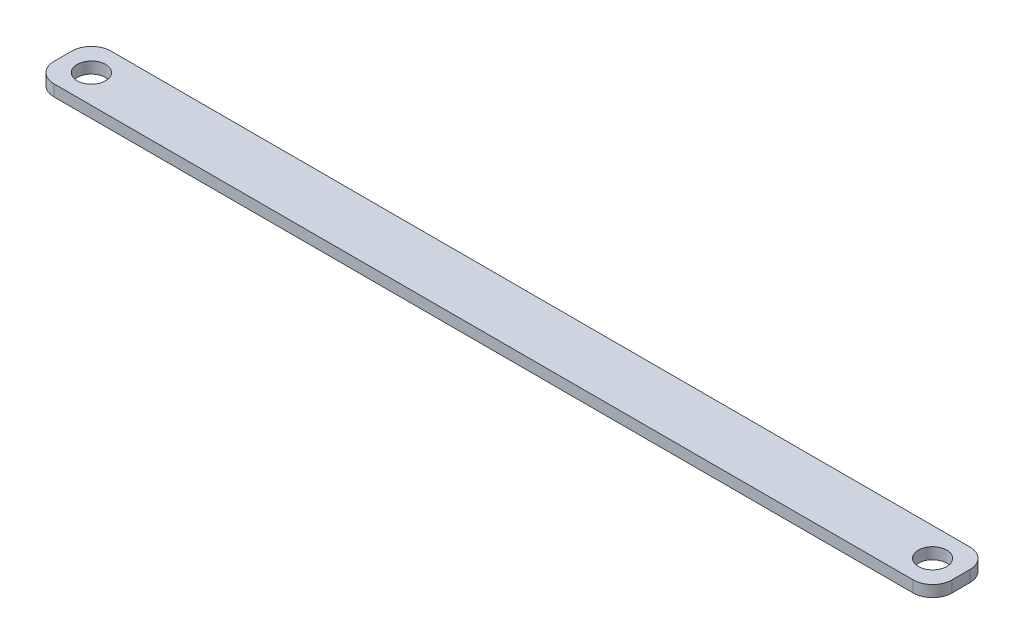
ISO-10303-21;
HEADER;
FILE_DESCRIPTION(('STEP AP214'),'2;1');
FILE_NAME('part.step','',(''),(''),'','','');
FILE_SCHEMA(('AUTOMOTIVE_DESIGN { 1 0 10303 214 1 1 1 1 }'));
ENDSEC;
DATA;
#1=APPLICATION_CONTEXT('core data for automotive mechanical design processes');
#2=APPLICATION_PROTOCOL_DEFINITION('international standard','automotive_design',2000,#1);
#3=PRODUCT_CONTEXT('',#1,'mechanical');
#4=PRODUCT('Part','Part','',(#3));
#5=PRODUCT_RELATED_PRODUCT_CATEGORY('part','',(#4));
#6=PRODUCT_DEFINITION_FORMATION('','',#4);
#7=PRODUCT_DEFINITION_CONTEXT('part definition',#1,'design');
#8=PRODUCT_DEFINITION('design','',#6,#7);
#9=PRODUCT_DEFINITION_SHAPE('','',#8);
#10=(LENGTH_UNIT() NAMED_UNIT(*) SI_UNIT(.MILLI.,.METRE.));
#11=(NAMED_UNIT(*) PLANE_ANGLE_UNIT() SI_UNIT($,.RADIAN.));
#12=(NAMED_UNIT(*) SI_UNIT($,.STERADIAN.) SOLID_ANGLE_UNIT());
#13=UNCERTAINTY_MEASURE_WITH_UNIT(LENGTH_MEASURE(1.E-05),#10,'distance_accuracy_value','');
#14=(GEOMETRIC_REPRESENTATION_CONTEXT(3) GLOBAL_UNCERTAINTY_ASSIGNED_CONTEXT((#13)) GLOBAL_UNIT_ASSIGNED_CONTEXT((#10,
#11,#12)) REPRESENTATION_CONTEXT('',''));
#15=CARTESIAN_POINT('',(0.,0.,0.));
#16=DIRECTION('',(0.,0.,1.));
#17=DIRECTION('',(1.,0.,0.));
#18=AXIS2_PLACEMENT_3D('',#15,#16,#17);
#19=CARTESIAN_POINT('',(-17.1112666800153,10.,32.8887333199847));
#20=DIRECTION('',(0.,-1.,0.));
#21=DIRECTION('',(0.,0.,-1.));
#22=AXIS2_PLACEMENT_3D('',#19,#20,#21);
#23=PLANE('',#22);
#24=CARTESIAN_POINT('',(-765.,10.,25.0000000000001));
#25=DIRECTION('',(0.,1.,0.));
#26=DIRECTION('',(0.,0.,1.));
#27=AXIS2_PLACEMENT_3D('',#24,#25,#26);
#28=CIRCLE('',#27,12.5);
#29=CARTESIAN_POINT('',(-765.,10.,37.5000000000001));
#30=VERTEX_POINT('',#29);
#31=EDGE_CURVE('E134',#30,#30,#28,.T.);
#32=ORIENTED_EDGE('',*,*,#31,.F.);
#33=EDGE_LOOP('',(#32));
#34=FACE_BOUND('',#33,.T.);
#35=CARTESIAN_POINT('',(-17.1112666800153,10.,32.8887333199847));
#36=DIRECTION('',(0.,1.,0.));
#37=DIRECTION('',(0.,0.,-1.));
#38=AXIS2_PLACEMENT_3D('',#35,#36,#37);
#39=CIRCLE('',#38,17.1112666800153);
#40=CARTESIAN_POINT('',(-17.1112666800154,10.,50.));
#41=VERTEX_POINT('',#40);
#42=CARTESIAN_POINT('',(0.,10.,32.8887333199845));
#43=VERTEX_POINT('',#42);
#44=EDGE_CURVE('E145',#41,#43,#39,.T.);
#45=ORIENTED_EDGE('',*,*,#44,.T.);
#46=DIRECTION('',(0.,0.,-1.));
#47=VECTOR('',#46,1.);
#48=CARTESIAN_POINT('',(0.,10.,17.1112666800155));
#49=LINE('',#48,#47);
#50=CARTESIAN_POINT('',(0.,10.,17.1112666800155));
#51=VERTEX_POINT('',#50);
#52=EDGE_CURVE('E93',#43,#51,#49,.T.);
#53=ORIENTED_EDGE('',*,*,#52,.T.);
#54=CARTESIAN_POINT('',(-17.1112666800153,10.,17.1112666800153));
#55=DIRECTION('',(0.,1.,0.));
#56=DIRECTION('',(0.,0.,-1.));
#57=AXIS2_PLACEMENT_3D('',#54,#55,#56);
#58=CIRCLE('',#57,17.1112666800153);
#59=CARTESIAN_POINT('',(-17.1112666800155,10.,0.));
#60=VERTEX_POINT('',#59);
#61=EDGE_CURVE('E160',#51,#60,#58,.T.);
#62=ORIENTED_EDGE('',*,*,#61,.T.);
#63=DIRECTION('',(-1.,0.,0.));
#64=VECTOR('',#63,1.);
#65=CARTESIAN_POINT('',(-17.1112666800155,10.,0.));
#66=LINE('',#65,#64);
#67=CARTESIAN_POINT('',(-772.888733319985,10.,0.));
#68=VERTEX_POINT('',#67);
#69=EDGE_CURVE('E173',#60,#68,#66,.T.);
#70=ORIENTED_EDGE('',*,*,#69,.T.);
#71=CARTESIAN_POINT('',(-772.888733319985,10.,17.1112666800154));
#72=DIRECTION('',(0.,1.,0.));
#73=DIRECTION('',(0.,0.,1.));
#74=AXIS2_PLACEMENT_3D('',#71,#72,#73);
#75=CIRCLE('',#74,17.1112666800153);
#76=CARTESIAN_POINT('',(-790.,10.,17.1112666800155));
#77=VERTEX_POINT('',#76);
#78=EDGE_CURVE('E112',#68,#77,#75,.T.);
#79=ORIENTED_EDGE('',*,*,#78,.T.);
#80=DIRECTION('',(0.,0.,1.));
#81=VECTOR('',#80,1.);
#82=CARTESIAN_POINT('',(-790.,10.,17.1112666800156));
#83=LINE('',#82,#81);
#84=CARTESIAN_POINT('',(-790.,10.,32.8887333199846));
#85=VERTEX_POINT('',#84);
#86=EDGE_CURVE('E106',#77,#85,#83,.T.);
#87=ORIENTED_EDGE('',*,*,#86,.T.);
#88=CARTESIAN_POINT('',(-772.888733319985,10.,32.8887333199848));
#89=DIRECTION('',(0.,1.,0.));
#90=DIRECTION('',(0.,0.,-1.));
#91=AXIS2_PLACEMENT_3D('',#88,#89,#90);
#92=CIRCLE('',#91,17.1112666800153);
#93=CARTESIAN_POINT('',(-772.888733319985,10.,50.0000000000001));
#94=VERTEX_POINT('',#93);
#95=EDGE_CURVE('E110',#85,#94,#92,.T.);
#96=ORIENTED_EDGE('',*,*,#95,.T.);
#97=DIRECTION('',(1.,0.,0.));
#98=VECTOR('',#97,1.);
#99=CARTESIAN_POINT('',(-17.1112666800154,10.,50.));
#100=LINE('',#99,#98);
#101=EDGE_CURVE('E50',#94,#41,#100,.T.);
#102=ORIENTED_EDGE('',*,*,#101,.T.);
#103=EDGE_LOOP('',(#45,#53,#62,#70,#79,#87,#96,#102));
#104=FACE_BOUND('',#103,.T.);
#105=CARTESIAN_POINT('',(-25.,10.,25.));
#106=DIRECTION('',(0.,1.,0.));
#107=DIRECTION('',(0.,0.,1.));
#108=AXIS2_PLACEMENT_3D('',#105,#106,#107);
#109=CIRCLE('',#108,12.5);
#110=CARTESIAN_POINT('',(-25.,10.,37.5));
#111=VERTEX_POINT('',#110);
#112=EDGE_CURVE('E182',#111,#111,#109,.T.);
#113=ORIENTED_EDGE('',*,*,#112,.F.);
#114=EDGE_LOOP('',(#113));
#115=FACE_BOUND('',#114,.T.);
#116=ADVANCED_FACE('F33',(#34,#104,#115),#23,.F.);
#117=CARTESIAN_POINT('',(-17.1112666800153,0.,32.8887333199847));
#118=DIRECTION('',(0.,-1.,0.));
#119=DIRECTION('',(0.,0.,-1.));
#120=AXIS2_PLACEMENT_3D('',#117,#118,#119);
#121=PLANE('',#120);
#122=CARTESIAN_POINT('',(-765.,0.,25.0000000000001));
#123=DIRECTION('',(0.,1.,0.));
#124=DIRECTION('',(0.,0.,1.));
#125=AXIS2_PLACEMENT_3D('',#122,#123,#124);
#126=CIRCLE('',#125,12.5);
#127=CARTESIAN_POINT('',(-765.,0.,37.5000000000001));
#128=VERTEX_POINT('',#127);
#129=EDGE_CURVE('E179',#128,#128,#126,.T.);
#130=ORIENTED_EDGE('',*,*,#129,.T.);
#131=EDGE_LOOP('',(#130));
#132=FACE_BOUND('',#131,.T.);
#133=CARTESIAN_POINT('',(-17.1112666800153,0.,32.8887333199847));
#134=DIRECTION('',(0.,1.,0.));
#135=DIRECTION('',(0.,0.,-1.));
#136=AXIS2_PLACEMENT_3D('',#133,#134,#135);
#137=CIRCLE('',#136,17.1112666800153);
#138=CARTESIAN_POINT('',(-17.1112666800154,0.,50.));
#139=VERTEX_POINT('',#138);
#140=CARTESIAN_POINT('',(0.,0.,32.8887333199845));
#141=VERTEX_POINT('',#140);
#142=EDGE_CURVE('E130',#139,#141,#137,.T.);
#143=ORIENTED_EDGE('',*,*,#142,.F.);
#144=DIRECTION('',(1.,0.,0.));
#145=VECTOR('',#144,1.);
#146=CARTESIAN_POINT('',(-17.1112666800154,0.,50.));
#147=LINE('',#146,#145);
#148=CARTESIAN_POINT('',(-772.888733319985,0.,50.0000000000001));
#149=VERTEX_POINT('',#148);
#150=EDGE_CURVE('E85',#149,#139,#147,.T.);
#151=ORIENTED_EDGE('',*,*,#150,.F.);
#152=CARTESIAN_POINT('',(-772.888733319985,0.,32.8887333199848));
#153=DIRECTION('',(0.,1.,0.));
#154=DIRECTION('',(0.,0.,-1.));
#155=AXIS2_PLACEMENT_3D('',#152,#153,#154);
#156=CIRCLE('',#155,17.1112666800153);
#157=CARTESIAN_POINT('',(-790.,0.,32.8887333199846));
#158=VERTEX_POINT('',#157);
#159=EDGE_CURVE('E79',#158,#149,#156,.T.);
#160=ORIENTED_EDGE('',*,*,#159,.F.);
#161=DIRECTION('',(0.,0.,1.));
#162=VECTOR('',#161,1.);
#163=CARTESIAN_POINT('',(-790.,0.,17.1112666800156));
#164=LINE('',#163,#162);
#165=CARTESIAN_POINT('',(-790.,0.,17.1112666800155));
#166=VERTEX_POINT('',#165);
#167=EDGE_CURVE('E120',#166,#158,#164,.T.);
#168=ORIENTED_EDGE('',*,*,#167,.F.);
#169=CARTESIAN_POINT('',(-772.888733319985,0.,17.1112666800154));
#170=DIRECTION('',(0.,1.,0.));
#171=DIRECTION('',(0.,0.,1.));
#172=AXIS2_PLACEMENT_3D('',#169,#170,#171);
#173=CIRCLE('',#172,17.1112666800153);
#174=CARTESIAN_POINT('',(-772.888733319985,0.,0.));
#175=VERTEX_POINT('',#174);
#176=EDGE_CURVE('E140',#175,#166,#173,.T.);
#177=ORIENTED_EDGE('',*,*,#176,.F.);
#178=DIRECTION('',(-1.,0.,0.));
#179=VECTOR('',#178,1.);
#180=CARTESIAN_POINT('',(-17.1112666800155,0.,0.));
#181=LINE('',#180,#179);
#182=CARTESIAN_POINT('',(-17.1112666800155,0.,0.));
#183=VERTEX_POINT('',#182);
#184=EDGE_CURVE('E138',#183,#175,#181,.T.);
#185=ORIENTED_EDGE('',*,*,#184,.F.);
#186=CARTESIAN_POINT('',(-17.1112666800153,0.,17.1112666800153));
#187=DIRECTION('',(0.,1.,0.));
#188=DIRECTION('',(0.,0.,-1.));
#189=AXIS2_PLACEMENT_3D('',#186,#187,#188);
#190=CIRCLE('',#189,17.1112666800153);
#191=CARTESIAN_POINT('',(0.,0.,17.1112666800155));
#192=VERTEX_POINT('',#191);
#193=EDGE_CURVE('E136',#192,#183,#190,.T.);
#194=ORIENTED_EDGE('',*,*,#193,.F.);
#195=DIRECTION('',(0.,0.,-1.));
#196=VECTOR('',#195,1.);
#197=CARTESIAN_POINT('',(0.,0.,17.1112666800155));
#198=LINE('',#197,#196);
#199=EDGE_CURVE('E133',#141,#192,#198,.T.);
#200=ORIENTED_EDGE('',*,*,#199,.F.);
#201=EDGE_LOOP('',(#143,#151,#160,#168,#177,#185,#194,#200));
#202=FACE_BOUND('',#201,.T.);
#203=CARTESIAN_POINT('',(-25.,0.,25.));
#204=DIRECTION('',(0.,1.,0.));
#205=DIRECTION('',(0.,0.,1.));
#206=AXIS2_PLACEMENT_3D('',#203,#204,#205);
#207=CIRCLE('',#206,12.5);
#208=CARTESIAN_POINT('',(-25.,0.,37.5));
#209=VERTEX_POINT('',#208);
#210=EDGE_CURVE('E185',#209,#209,#207,.T.);
#211=ORIENTED_EDGE('',*,*,#210,.T.);
#212=EDGE_LOOP('',(#211));
#213=FACE_BOUND('',#212,.T.);
#214=ADVANCED_FACE('F164',(#132,#202,#213),#121,.T.);
#215=CARTESIAN_POINT('',(-17.1112666800153,10.,32.8887333199847));
#216=DIRECTION('',(0.,-1.,0.));
#217=DIRECTION('',(0.,0.,-1.));
#218=AXIS2_PLACEMENT_3D('',#215,#216,#217);
#219=CYLINDRICAL_SURFACE('',#218,17.1112666800153);
#220=ORIENTED_EDGE('',*,*,#142,.T.);
#221=DIRECTION('',(0.,-1.,0.));
#222=VECTOR('',#221,1.);
#223=CARTESIAN_POINT('',(0.,10.,32.8887333199845));
#224=LINE('',#223,#222);
#225=EDGE_CURVE('E11',#43,#141,#224,.T.);
#226=ORIENTED_EDGE('',*,*,#225,.F.);
#227=ORIENTED_EDGE('',*,*,#44,.F.);
#228=DIRECTION('',(0.,-1.,0.));
#229=VECTOR('',#228,1.);
#230=CARTESIAN_POINT('',(-17.1112666800154,10.,50.));
#231=LINE('',#230,#229);
#232=EDGE_CURVE('E126',#41,#139,#231,.T.);
#233=ORIENTED_EDGE('',*,*,#232,.T.);
#234=EDGE_LOOP('',(#220,#226,#227,#233));
#235=FACE_BOUND('',#234,.T.);
#236=ADVANCED_FACE('F35',(#235),#219,.T.);
#237=CARTESIAN_POINT('',(0.,10.,17.1112666800155));
#238=DIRECTION('',(-1.,0.,0.));
#239=DIRECTION('',(0.,0.,1.));
#240=AXIS2_PLACEMENT_3D('',#237,#238,#239);
#241=PLANE('',#240);
#242=ORIENTED_EDGE('',*,*,#199,.T.);
#243=DIRECTION('',(0.,-1.,0.));
#244=VECTOR('',#243,1.);
#245=CARTESIAN_POINT('',(0.,10.,17.1112666800155));
#246=LINE('',#245,#244);
#247=EDGE_CURVE('E42',#51,#192,#246,.T.);
#248=ORIENTED_EDGE('',*,*,#247,.F.);
#249=ORIENTED_EDGE('',*,*,#52,.F.);
#250=ORIENTED_EDGE('',*,*,#225,.T.);
#251=EDGE_LOOP('',(#242,#248,#249,#250));
#252=FACE_BOUND('',#251,.T.);
#253=ADVANCED_FACE('F218',(#252),#241,.F.);
#254=CARTESIAN_POINT('',(-17.1112666800153,10.,17.1112666800153));
#255=DIRECTION('',(0.,-1.,0.));
#256=DIRECTION('',(0.,0.,-1.));
#257=AXIS2_PLACEMENT_3D('',#254,#255,#256);
#258=CYLINDRICAL_SURFACE('',#257,17.1112666800153);
#259=ORIENTED_EDGE('',*,*,#193,.T.);
#260=DIRECTION('',(0.,-1.,0.));
#261=VECTOR('',#260,1.);
#262=CARTESIAN_POINT('',(-17.1112666800155,10.,0.));
#263=LINE('',#262,#261);
#264=EDGE_CURVE('E152',#60,#183,#263,.T.);
#265=ORIENTED_EDGE('',*,*,#264,.F.);
#266=ORIENTED_EDGE('',*,*,#61,.F.);
#267=ORIENTED_EDGE('',*,*,#247,.T.);
#268=EDGE_LOOP('',(#259,#265,#266,#267));
#269=FACE_BOUND('',#268,.T.);
#270=ADVANCED_FACE('F158',(#269),#258,.T.);
#271=CARTESIAN_POINT('',(-17.1112666800155,10.,0.));
#272=DIRECTION('',(0.,0.,1.));
#273=DIRECTION('',(1.,0.,0.));
#274=AXIS2_PLACEMENT_3D('',#271,#272,#273);
#275=PLANE('',#274);
#276=ORIENTED_EDGE('',*,*,#184,.T.);
#277=DIRECTION('',(0.,-1.,0.));
#278=VECTOR('',#277,1.);
#279=CARTESIAN_POINT('',(-772.888733319985,10.,0.));
#280=LINE('',#279,#278);
#281=EDGE_CURVE('E149',#68,#175,#280,.T.);
#282=ORIENTED_EDGE('',*,*,#281,.F.);
#283=ORIENTED_EDGE('',*,*,#69,.F.);
#284=ORIENTED_EDGE('',*,*,#264,.T.);
#285=EDGE_LOOP('',(#276,#282,#283,#284));
#286=FACE_BOUND('',#285,.T.);
#287=ADVANCED_FACE('F169',(#286),#275,.F.);
#288=CARTESIAN_POINT('',(-772.888733319985,10.,17.1112666800154));
#289=DIRECTION('',(0.,-1.,0.));
#290=DIRECTION('',(0.,0.,-1.));
#291=AXIS2_PLACEMENT_3D('',#288,#289,#290);
#292=CYLINDRICAL_SURFACE('',#291,17.1112666800153);
#293=ORIENTED_EDGE('',*,*,#176,.T.);
#294=DIRECTION('',(0.,-1.,0.));
#295=VECTOR('',#294,1.);
#296=CARTESIAN_POINT('',(-790.,10.,17.1112666800155));
#297=LINE('',#296,#295);
#298=EDGE_CURVE('E121',#77,#166,#297,.T.);
#299=ORIENTED_EDGE('',*,*,#298,.F.);
#300=ORIENTED_EDGE('',*,*,#78,.F.);
#301=ORIENTED_EDGE('',*,*,#281,.T.);
#302=EDGE_LOOP('',(#293,#299,#300,#301));
#303=FACE_BOUND('',#302,.T.);
#304=ADVANCED_FACE('F172',(#303),#292,.T.);
#305=CARTESIAN_POINT('',(-790.,10.,17.1112666800156));
#306=DIRECTION('',(1.,0.,0.));
#307=DIRECTION('',(0.,0.,-1.));
#308=AXIS2_PLACEMENT_3D('',#305,#306,#307);
#309=PLANE('',#308);
#310=ORIENTED_EDGE('',*,*,#167,.T.);
#311=DIRECTION('',(0.,-1.,0.));
#312=VECTOR('',#311,1.);
#313=CARTESIAN_POINT('',(-790.,10.,32.8887333199846));
#314=LINE('',#313,#312);
#315=EDGE_CURVE('E117',#85,#158,#314,.T.);
#316=ORIENTED_EDGE('',*,*,#315,.F.);
#317=ORIENTED_EDGE('',*,*,#86,.F.);
#318=ORIENTED_EDGE('',*,*,#298,.T.);
#319=EDGE_LOOP('',(#310,#316,#317,#318));
#320=FACE_BOUND('',#319,.T.);
#321=ADVANCED_FACE('F118',(#320),#309,.F.);
#322=CARTESIAN_POINT('',(-772.888733319985,10.,32.8887333199848));
#323=DIRECTION('',(0.,-1.,0.));
#324=DIRECTION('',(0.,0.,-1.));
#325=AXIS2_PLACEMENT_3D('',#322,#323,#324);
#326=CYLINDRICAL_SURFACE('',#325,17.1112666800153);
#327=ORIENTED_EDGE('',*,*,#159,.T.);
#328=DIRECTION('',(0.,-1.,0.));
#329=VECTOR('',#328,1.);
#330=CARTESIAN_POINT('',(-772.888733319985,10.,50.0000000000001));
#331=LINE('',#330,#329);
#332=EDGE_CURVE('E122',#94,#149,#331,.T.);
#333=ORIENTED_EDGE('',*,*,#332,.F.);
#334=ORIENTED_EDGE('',*,*,#95,.F.);
#335=ORIENTED_EDGE('',*,*,#315,.T.);
#336=EDGE_LOOP('',(#327,#333,#334,#335));
#337=FACE_BOUND('',#336,.T.);
#338=ADVANCED_FACE('F124',(#337),#326,.T.);
#339=CARTESIAN_POINT('',(-17.1112666800154,10.,50.));
#340=DIRECTION('',(0.,0.,-1.));
#341=DIRECTION('',(-1.,0.,0.));
#342=AXIS2_PLACEMENT_3D('',#339,#340,#341);
#343=PLANE('',#342);
#344=ORIENTED_EDGE('',*,*,#150,.T.);
#345=ORIENTED_EDGE('',*,*,#232,.F.);
#346=ORIENTED_EDGE('',*,*,#101,.F.);
#347=ORIENTED_EDGE('',*,*,#332,.T.);
#348=EDGE_LOOP('',(#344,#345,#346,#347));
#349=FACE_BOUND('',#348,.T.);
#350=ADVANCED_FACE('F206',(#349),#343,.F.);
#351=CARTESIAN_POINT('',(-765.,10.,25.0000000000001));
#352=DIRECTION('',(0.,-1.,0.));
#353=DIRECTION('',(0.,0.,-1.));
#354=AXIS2_PLACEMENT_3D('',#351,#352,#353);
#355=CYLINDRICAL_SURFACE('',#354,12.5);
#356=ORIENTED_EDGE('',*,*,#31,.T.);
#357=EDGE_LOOP('',(#356));
#358=FACE_BOUND('',#357,.T.);
#359=ORIENTED_EDGE('',*,*,#129,.F.);
#360=EDGE_LOOP('',(#359));
#361=FACE_BOUND('',#360,.T.);
#362=ADVANCED_FACE('F203',(#358,#361),#355,.F.);
#363=CARTESIAN_POINT('',(-25.,10.,25.));
#364=DIRECTION('',(0.,-1.,0.));
#365=DIRECTION('',(0.,0.,-1.));
#366=AXIS2_PLACEMENT_3D('',#363,#364,#365);
#367=CYLINDRICAL_SURFACE('',#366,12.5);
#368=ORIENTED_EDGE('',*,*,#112,.T.);
#369=EDGE_LOOP('',(#368));
#370=FACE_BOUND('',#369,.T.);
#371=ORIENTED_EDGE('',*,*,#210,.F.);
#372=EDGE_LOOP('',(#371));
#373=FACE_BOUND('',#372,.T.);
#374=ADVANCED_FACE('F191',(#370,#373),#367,.F.);
#375=CLOSED_SHELL('',(#116,#214,#236,#253,#270,#287,#304,#321,#338,#350,#362,#374));
#376=MANIFOLD_SOLID_BREP('B2',#375);
#377=ADVANCED_BREP_SHAPE_REPRESENTATION('',(#18,#376),#14);
#378=SHAPE_DEFINITION_REPRESENTATION(#9,#377);
ENDSEC;
END-ISO-10303-21;
